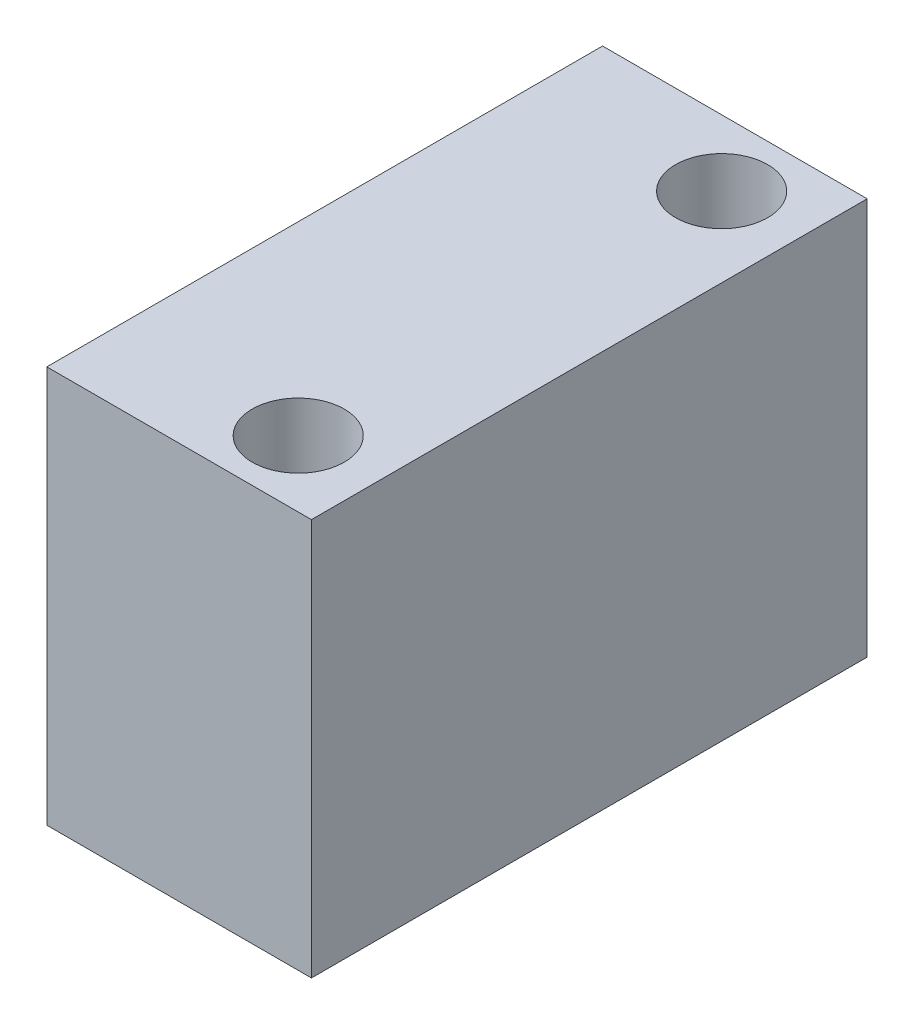
ISO-10303-21;
HEADER;
FILE_DESCRIPTION(('STEP AP214'),'2;1');
FILE_NAME('part.step','',(''),(''),'','','');
FILE_SCHEMA(('AUTOMOTIVE_DESIGN { 1 0 10303 214 1 1 1 1 }'));
ENDSEC;
DATA;
#1=APPLICATION_CONTEXT('core data for automotive mechanical design processes');
#2=APPLICATION_PROTOCOL_DEFINITION('international standard','automotive_design',2000,#1);
#3=PRODUCT_CONTEXT('',#1,'mechanical');
#4=PRODUCT('Part','Part','',(#3));
#5=PRODUCT_RELATED_PRODUCT_CATEGORY('part','',(#4));
#6=PRODUCT_DEFINITION_FORMATION('','',#4);
#7=PRODUCT_DEFINITION_CONTEXT('part definition',#1,'design');
#8=PRODUCT_DEFINITION('design','',#6,#7);
#9=PRODUCT_DEFINITION_SHAPE('','',#8);
#10=(LENGTH_UNIT() NAMED_UNIT(*) SI_UNIT(.MILLI.,.METRE.));
#11=(NAMED_UNIT(*) PLANE_ANGLE_UNIT() SI_UNIT($,.RADIAN.));
#12=(NAMED_UNIT(*) SI_UNIT($,.STERADIAN.) SOLID_ANGLE_UNIT());
#13=UNCERTAINTY_MEASURE_WITH_UNIT(LENGTH_MEASURE(1.E-05),#10,'distance_accuracy_value','');
#14=(GEOMETRIC_REPRESENTATION_CONTEXT(3) GLOBAL_UNCERTAINTY_ASSIGNED_CONTEXT((#13)) GLOBAL_UNIT_ASSIGNED_CONTEXT((#10,
#11,#12)) REPRESENTATION_CONTEXT('',''));
#15=CARTESIAN_POINT('',(0.,0.,0.));
#16=DIRECTION('',(0.,0.,1.));
#17=DIRECTION('',(1.,0.,0.));
#18=AXIS2_PLACEMENT_3D('',#15,#16,#17);
#19=CARTESIAN_POINT('',(1.905,9.525,0.));
#20=DIRECTION('',(1.,0.,0.));
#21=DIRECTION('',(0.,0.,-1.));
#22=AXIS2_PLACEMENT_3D('',#19,#20,#21);
#23=PLANE('',#22);
#24=DIRECTION('',(0.,0.,1.));
#25=VECTOR('',#24,1.);
#26=CARTESIAN_POINT('',(1.905,0.,0.));
#27=LINE('',#26,#25);
#28=CARTESIAN_POINT('',(1.905,0.,-6.6675));
#29=VERTEX_POINT('',#28);
#30=CARTESIAN_POINT('',(1.905,0.,6.6675));
#31=VERTEX_POINT('',#30);
#32=EDGE_CURVE('E114',#29,#31,#27,.T.);
#33=ORIENTED_EDGE('',*,*,#32,.F.);
#34=DIRECTION('',(0.,-1.,0.));
#35=VECTOR('',#34,1.);
#36=CARTESIAN_POINT('',(1.905,9.525,-6.6675));
#37=LINE('',#36,#35);
#38=CARTESIAN_POINT('',(1.905,9.525,-6.6675));
#39=VERTEX_POINT('',#38);
#40=EDGE_CURVE('E11',#39,#29,#37,.T.);
#41=ORIENTED_EDGE('',*,*,#40,.F.);
#42=DIRECTION('',(0.,0.,1.));
#43=VECTOR('',#42,1.);
#44=CARTESIAN_POINT('',(1.905,9.525,0.));
#45=LINE('',#44,#43);
#46=CARTESIAN_POINT('',(1.905,9.525,6.6675));
#47=VERTEX_POINT('',#46);
#48=EDGE_CURVE('E106',#39,#47,#45,.T.);
#49=ORIENTED_EDGE('',*,*,#48,.T.);
#50=DIRECTION('',(0.,-1.,0.));
#51=VECTOR('',#50,1.);
#52=CARTESIAN_POINT('',(1.905,9.525,6.6675));
#53=LINE('',#52,#51);
#54=EDGE_CURVE('E44',#47,#31,#53,.T.);
#55=ORIENTED_EDGE('',*,*,#54,.T.);
#56=EDGE_LOOP('',(#33,#41,#49,#55));
#57=FACE_BOUND('',#56,.T.);
#58=ADVANCED_FACE('F35',(#57),#23,.T.);
#59=CARTESIAN_POINT('',(0.,9.525,-6.6675));
#60=DIRECTION('',(0.,0.,-1.));
#61=DIRECTION('',(-1.,0.,0.));
#62=AXIS2_PLACEMENT_3D('',#59,#60,#61);
#63=PLANE('',#62);
#64=DIRECTION('',(1.,0.,0.));
#65=VECTOR('',#64,1.);
#66=CARTESIAN_POINT('',(0.,0.,-6.6675));
#67=LINE('',#66,#65);
#68=CARTESIAN_POINT('',(-4.445,0.,-6.6675));
#69=VERTEX_POINT('',#68);
#70=EDGE_CURVE('E116',#69,#29,#67,.T.);
#71=ORIENTED_EDGE('',*,*,#70,.F.);
#72=DIRECTION('',(0.,1.,0.));
#73=VECTOR('',#72,1.);
#74=CARTESIAN_POINT('',(-4.445,0.,-6.6675));
#75=LINE('',#74,#73);
#76=CARTESIAN_POINT('',(-4.445,9.525,-6.6675));
#77=VERTEX_POINT('',#76);
#78=EDGE_CURVE('E94',#69,#77,#75,.T.);
#79=ORIENTED_EDGE('',*,*,#78,.T.);
#80=DIRECTION('',(1.,0.,0.));
#81=VECTOR('',#80,1.);
#82=CARTESIAN_POINT('',(0.,9.525,-6.6675));
#83=LINE('',#82,#81);
#84=EDGE_CURVE('E85',#77,#39,#83,.T.);
#85=ORIENTED_EDGE('',*,*,#84,.T.);
#86=ORIENTED_EDGE('',*,*,#40,.T.);
#87=EDGE_LOOP('',(#71,#79,#85,#86));
#88=FACE_BOUND('',#87,.T.);
#89=ADVANCED_FACE('F124',(#88),#63,.T.);
#90=CARTESIAN_POINT('',(0.,9.525,6.6675));
#91=DIRECTION('',(0.,0.,-1.));
#92=DIRECTION('',(-1.,0.,0.));
#93=AXIS2_PLACEMENT_3D('',#90,#91,#92);
#94=PLANE('',#93);
#95=DIRECTION('',(1.,0.,0.));
#96=VECTOR('',#95,1.);
#97=CARTESIAN_POINT('',(0.,0.,6.6675));
#98=LINE('',#97,#96);
#99=CARTESIAN_POINT('',(-4.445,0.,6.6675));
#100=VERTEX_POINT('',#99);
#101=EDGE_CURVE('E71',#100,#31,#98,.T.);
#102=ORIENTED_EDGE('',*,*,#101,.T.);
#103=ORIENTED_EDGE('',*,*,#54,.F.);
#104=DIRECTION('',(1.,0.,0.));
#105=VECTOR('',#104,1.);
#106=CARTESIAN_POINT('',(0.,9.525,6.6675));
#107=LINE('',#106,#105);
#108=CARTESIAN_POINT('',(-4.445,9.525,6.6675));
#109=VERTEX_POINT('',#108);
#110=EDGE_CURVE('E52',#109,#47,#107,.T.);
#111=ORIENTED_EDGE('',*,*,#110,.F.);
#112=DIRECTION('',(0.,1.,0.));
#113=VECTOR('',#112,1.);
#114=CARTESIAN_POINT('',(-4.445,0.,6.6675));
#115=LINE('',#114,#113);
#116=EDGE_CURVE('E81',#100,#109,#115,.T.);
#117=ORIENTED_EDGE('',*,*,#116,.F.);
#118=EDGE_LOOP('',(#102,#103,#111,#117));
#119=FACE_BOUND('',#118,.T.);
#120=ADVANCED_FACE('F80',(#119),#94,.F.);
#121=CARTESIAN_POINT('',(0.,9.525,-5.08));
#122=DIRECTION('',(0.,-1.,0.));
#123=DIRECTION('',(0.,0.,-1.));
#124=AXIS2_PLACEMENT_3D('',#121,#122,#123);
#125=CYLINDRICAL_SURFACE('',#124,1.1049);
#126=CARTESIAN_POINT('',(0.,9.525,-5.08));
#127=DIRECTION('',(0.,1.,0.));
#128=DIRECTION('',(0.,0.,1.));
#129=AXIS2_PLACEMENT_3D('',#126,#127,#128);
#130=CIRCLE('',#129,1.1049);
#131=CARTESIAN_POINT('',(0.,9.525,-6.1849));
#132=VERTEX_POINT('',#131);
#133=EDGE_CURVE('E103',#132,#132,#130,.T.);
#134=CARTESIAN_POINT('',(0.,0.,-5.08));
#135=DIRECTION('',(0.,1.,0.));
#136=DIRECTION('',(0.,0.,1.));
#137=AXIS2_PLACEMENT_3D('',#134,#135,#136);
#138=CIRCLE('',#137,1.1049);
#139=CARTESIAN_POINT('',(0.,0.,-6.1849));
#140=VERTEX_POINT('',#139);
#141=EDGE_CURVE('E93',#140,#140,#138,.T.);
#142=CARTESIAN_POINT('',(0.,9.525,-6.1849));
#143=CARTESIAN_POINT('',(0.,9.42578125,-6.1849));
#144=CARTESIAN_POINT('',(0.,9.3265625,-6.1849));
#145=CARTESIAN_POINT('',(0.,9.128125,-6.1849));
#146=CARTESIAN_POINT('',(0.,9.02890625,-6.1849));
#147=CARTESIAN_POINT('',(0.,8.83046875,-6.1849));
#148=CARTESIAN_POINT('',(0.,8.73125,-6.1849));
#149=CARTESIAN_POINT('',(0.,8.5328125,-6.1849));
#150=CARTESIAN_POINT('',(0.,8.43359375,-6.1849));
#151=CARTESIAN_POINT('',(0.,8.23515625,-6.1849));
#152=CARTESIAN_POINT('',(0.,8.1359375,-6.1849));
#153=CARTESIAN_POINT('',(0.,7.9375,-6.1849));
#154=CARTESIAN_POINT('',(0.,7.83828125,-6.1849));
#155=CARTESIAN_POINT('',(0.,7.63984375,-6.1849));
#156=CARTESIAN_POINT('',(0.,7.540625,-6.1849));
#157=CARTESIAN_POINT('',(0.,7.3421875,-6.1849));
#158=CARTESIAN_POINT('',(0.,7.24296875,-6.1849));
#159=CARTESIAN_POINT('',(0.,7.04453125,-6.1849));
#160=CARTESIAN_POINT('',(0.,6.9453125,-6.1849));
#161=CARTESIAN_POINT('',(0.,6.746875,-6.1849));
#162=CARTESIAN_POINT('',(0.,6.64765625,-6.1849));
#163=CARTESIAN_POINT('',(0.,6.44921875,-6.1849));
#164=CARTESIAN_POINT('',(0.,6.35,-6.1849));
#165=CARTESIAN_POINT('',(0.,6.1515625,-6.1849));
#166=CARTESIAN_POINT('',(0.,6.05234375,-6.1849));
#167=CARTESIAN_POINT('',(0.,5.85390625,-6.1849));
#168=CARTESIAN_POINT('',(0.,5.7546875,-6.1849));
#169=CARTESIAN_POINT('',(0.,5.55625,-6.1849));
#170=CARTESIAN_POINT('',(0.,5.45703125,-6.1849));
#171=CARTESIAN_POINT('',(0.,5.25859375,-6.1849));
#172=CARTESIAN_POINT('',(0.,5.159375,-6.1849));
#173=CARTESIAN_POINT('',(0.,4.9609375,-6.1849));
#174=CARTESIAN_POINT('',(0.,4.86171875,-6.1849));
#175=CARTESIAN_POINT('',(0.,4.66328125,-6.1849));
#176=CARTESIAN_POINT('',(0.,4.5640625,-6.1849));
#177=CARTESIAN_POINT('',(0.,4.365625,-6.1849));
#178=CARTESIAN_POINT('',(0.,4.26640625,-6.1849));
#179=CARTESIAN_POINT('',(0.,4.06796875,-6.1849));
#180=CARTESIAN_POINT('',(0.,3.96875,-6.1849));
#181=CARTESIAN_POINT('',(0.,3.7703125,-6.1849));
#182=CARTESIAN_POINT('',(0.,3.67109375,-6.1849));
#183=CARTESIAN_POINT('',(0.,3.47265625,-6.1849));
#184=CARTESIAN_POINT('',(0.,3.3734375,-6.1849));
#185=CARTESIAN_POINT('',(0.,3.175,-6.1849));
#186=CARTESIAN_POINT('',(0.,3.07578125,-6.1849));
#187=CARTESIAN_POINT('',(0.,2.87734375,-6.1849));
#188=CARTESIAN_POINT('',(0.,2.778125,-6.1849));
#189=CARTESIAN_POINT('',(0.,2.5796875,-6.1849));
#190=CARTESIAN_POINT('',(0.,2.48046875,-6.1849));
#191=CARTESIAN_POINT('',(0.,2.28203125,-6.1849));
#192=CARTESIAN_POINT('',(0.,2.1828125,-6.1849));
#193=CARTESIAN_POINT('',(0.,1.984375,-6.1849));
#194=CARTESIAN_POINT('',(0.,1.88515625,-6.1849));
#195=CARTESIAN_POINT('',(0.,1.68671875,-6.1849));
#196=CARTESIAN_POINT('',(0.,1.5875,-6.1849));
#197=CARTESIAN_POINT('',(0.,1.3890625,-6.1849));
#198=CARTESIAN_POINT('',(0.,1.28984375,-6.1849));
#199=CARTESIAN_POINT('',(0.,1.09140625,-6.1849));
#200=CARTESIAN_POINT('',(0.,0.992187500000001,-6.1849));
#201=CARTESIAN_POINT('',(0.,0.793750000000001,-6.1849));
#202=CARTESIAN_POINT('',(0.,0.69453125,-6.1849));
#203=CARTESIAN_POINT('',(0.,0.49609375,-6.1849));
#204=CARTESIAN_POINT('',(0.,0.396875,-6.1849));
#205=CARTESIAN_POINT('',(0.,0.1984375,-6.1849));
#206=CARTESIAN_POINT('',(0.,0.0992187500000001,-6.1849));
#207=CARTESIAN_POINT('',(0.,0.,-6.1849));
#208=B_SPLINE_CURVE_WITH_KNOTS('',3,(#142,#143,#144,#145,#146,#147,#148,#149,#150,#151,#152,
#153,#154,#155,#156,#157,#158,#159,#160,#161,#162,#163,#164,#165,#166,#167,#168,#169,#170,#171,
#172,#173,#174,#175,#176,#177,#178,#179,#180,#181,#182,#183,#184,#185,#186,#187,#188,#189,#190,
#191,#192,#193,#194,#195,#196,#197,#198,#199,#200,#201,#202,#203,#204,#205,#206,#207),
.UNSPECIFIED.,.F.,.F.,(4,2,2,2,2,2,2,2,2,2,2,2,2,2,2,2,2,2,2,2,2,2,2,2,2,2,2,2,2,2,2,2,4),(0.,
0.297656249999998,0.595312499999999,0.892968749999999,1.190625,1.48828125,1.7859375,2.08359375,
2.38125,2.67890625,2.9765625,3.27421875,3.571875,3.86953125,4.1671875,4.46484375,4.7625,
5.06015625,5.3578125,5.65546875,5.953125,6.25078125,6.5484375,6.84609375,7.14375,7.44140625,
7.7390625,8.03671875,8.334375,8.63203125,8.9296875,9.22734375,9.525),.UNSPECIFIED.);
#209=EDGE_CURVE('BSEAM37',#132,#140,#208,.T.);
#210=ORIENTED_EDGE('',*,*,#133,.T.);
#211=ORIENTED_EDGE('',*,*,#141,.F.);
#212=ORIENTED_EDGE('',*,*,#209,.T.);
#213=ORIENTED_EDGE('',*,*,#209,.F.);
#214=EDGE_LOOP('',(#210,#212,#211,#213));
#215=FACE_BOUND('',#214,.T.);
#216=ADVANCED_FACE('F37',(#215),#125,.F.);
#217=CARTESIAN_POINT('',(0.,9.525,5.08));
#218=DIRECTION('',(0.,-1.,0.));
#219=DIRECTION('',(0.,0.,-1.));
#220=AXIS2_PLACEMENT_3D('',#217,#218,#219);
#221=CYLINDRICAL_SURFACE('',#220,1.1049);
#222=CARTESIAN_POINT('',(0.,9.525,5.08));
#223=DIRECTION('',(0.,1.,0.));
#224=DIRECTION('',(0.,0.,1.));
#225=AXIS2_PLACEMENT_3D('',#222,#223,#224);
#226=CIRCLE('',#225,1.1049);
#227=CARTESIAN_POINT('',(0.,9.525,3.9751));
#228=VERTEX_POINT('',#227);
#229=EDGE_CURVE('E84',#228,#228,#226,.F.);
#230=CARTESIAN_POINT('',(0.,0.,5.08));
#231=DIRECTION('',(0.,1.,0.));
#232=DIRECTION('',(0.,0.,1.));
#233=AXIS2_PLACEMENT_3D('',#230,#231,#232);
#234=CIRCLE('',#233,1.1049);
#235=CARTESIAN_POINT('',(0.,0.,3.9751));
#236=VERTEX_POINT('',#235);
#237=EDGE_CURVE('E107',#236,#236,#234,.F.);
#238=CARTESIAN_POINT('',(0.,9.525,3.9751));
#239=CARTESIAN_POINT('',(0.,9.42578125,3.9751));
#240=CARTESIAN_POINT('',(0.,9.3265625,3.9751));
#241=CARTESIAN_POINT('',(0.,9.128125,3.9751));
#242=CARTESIAN_POINT('',(0.,9.02890625,3.9751));
#243=CARTESIAN_POINT('',(0.,8.83046875,3.9751));
#244=CARTESIAN_POINT('',(0.,8.73125,3.9751));
#245=CARTESIAN_POINT('',(0.,8.5328125,3.9751));
#246=CARTESIAN_POINT('',(0.,8.43359375,3.9751));
#247=CARTESIAN_POINT('',(0.,8.23515625,3.9751));
#248=CARTESIAN_POINT('',(0.,8.1359375,3.9751));
#249=CARTESIAN_POINT('',(0.,7.9375,3.9751));
#250=CARTESIAN_POINT('',(0.,7.83828125,3.9751));
#251=CARTESIAN_POINT('',(0.,7.63984375,3.9751));
#252=CARTESIAN_POINT('',(0.,7.540625,3.9751));
#253=CARTESIAN_POINT('',(0.,7.3421875,3.9751));
#254=CARTESIAN_POINT('',(0.,7.24296875,3.9751));
#255=CARTESIAN_POINT('',(0.,7.04453125,3.9751));
#256=CARTESIAN_POINT('',(0.,6.9453125,3.9751));
#257=CARTESIAN_POINT('',(0.,6.746875,3.9751));
#258=CARTESIAN_POINT('',(0.,6.64765625,3.9751));
#259=CARTESIAN_POINT('',(0.,6.44921875,3.9751));
#260=CARTESIAN_POINT('',(0.,6.35,3.9751));
#261=CARTESIAN_POINT('',(0.,6.1515625,3.9751));
#262=CARTESIAN_POINT('',(0.,6.05234375,3.9751));
#263=CARTESIAN_POINT('',(0.,5.85390625,3.9751));
#264=CARTESIAN_POINT('',(0.,5.7546875,3.9751));
#265=CARTESIAN_POINT('',(0.,5.55625,3.9751));
#266=CARTESIAN_POINT('',(0.,5.45703125,3.9751));
#267=CARTESIAN_POINT('',(0.,5.25859375,3.9751));
#268=CARTESIAN_POINT('',(0.,5.159375,3.9751));
#269=CARTESIAN_POINT('',(0.,4.9609375,3.9751));
#270=CARTESIAN_POINT('',(0.,4.86171875,3.9751));
#271=CARTESIAN_POINT('',(0.,4.66328125,3.9751));
#272=CARTESIAN_POINT('',(0.,4.5640625,3.9751));
#273=CARTESIAN_POINT('',(0.,4.365625,3.9751));
#274=CARTESIAN_POINT('',(0.,4.26640625,3.9751));
#275=CARTESIAN_POINT('',(0.,4.06796875,3.9751));
#276=CARTESIAN_POINT('',(0.,3.96875,3.9751));
#277=CARTESIAN_POINT('',(0.,3.7703125,3.9751));
#278=CARTESIAN_POINT('',(0.,3.67109375,3.9751));
#279=CARTESIAN_POINT('',(0.,3.47265625,3.9751));
#280=CARTESIAN_POINT('',(0.,3.3734375,3.9751));
#281=CARTESIAN_POINT('',(0.,3.175,3.9751));
#282=CARTESIAN_POINT('',(0.,3.07578125,3.9751));
#283=CARTESIAN_POINT('',(0.,2.87734375,3.9751));
#284=CARTESIAN_POINT('',(0.,2.778125,3.9751));
#285=CARTESIAN_POINT('',(0.,2.5796875,3.9751));
#286=CARTESIAN_POINT('',(0.,2.48046875,3.9751));
#287=CARTESIAN_POINT('',(0.,2.28203125,3.9751));
#288=CARTESIAN_POINT('',(0.,2.1828125,3.9751));
#289=CARTESIAN_POINT('',(0.,1.984375,3.9751));
#290=CARTESIAN_POINT('',(0.,1.88515625,3.9751));
#291=CARTESIAN_POINT('',(0.,1.68671875,3.9751));
#292=CARTESIAN_POINT('',(0.,1.5875,3.9751));
#293=CARTESIAN_POINT('',(0.,1.3890625,3.9751));
#294=CARTESIAN_POINT('',(0.,1.28984375,3.9751));
#295=CARTESIAN_POINT('',(0.,1.09140625,3.9751));
#296=CARTESIAN_POINT('',(0.,0.992187500000001,3.9751));
#297=CARTESIAN_POINT('',(0.,0.793750000000001,3.9751));
#298=CARTESIAN_POINT('',(0.,0.69453125,3.9751));
#299=CARTESIAN_POINT('',(0.,0.49609375,3.9751));
#300=CARTESIAN_POINT('',(0.,0.396875,3.9751));
#301=CARTESIAN_POINT('',(0.,0.1984375,3.9751));
#302=CARTESIAN_POINT('',(0.,0.0992187500000001,3.9751));
#303=CARTESIAN_POINT('',(0.,0.,3.9751));
#304=B_SPLINE_CURVE_WITH_KNOTS('',3,(#238,#239,#240,#241,#242,#243,#244,#245,#246,#247,#248,
#249,#250,#251,#252,#253,#254,#255,#256,#257,#258,#259,#260,#261,#262,#263,#264,#265,#266,#267,
#268,#269,#270,#271,#272,#273,#274,#275,#276,#277,#278,#279,#280,#281,#282,#283,#284,#285,#286,
#287,#288,#289,#290,#291,#292,#293,#294,#295,#296,#297,#298,#299,#300,#301,#302,#303),
.UNSPECIFIED.,.F.,.F.,(4,2,2,2,2,2,2,2,2,2,2,2,2,2,2,2,2,2,2,2,2,2,2,2,2,2,2,2,2,2,2,2,4),(0.,
0.297656249999998,0.595312499999999,0.892968749999999,1.190625,1.48828125,1.7859375,2.08359375,
2.38125,2.67890625,2.9765625,3.27421875,3.571875,3.86953125,4.1671875,4.46484375,4.7625,
5.06015625,5.3578125,5.65546875,5.953125,6.25078125,6.5484375,6.84609375,7.14375,7.44140625,
7.7390625,8.03671875,8.334375,8.63203125,8.9296875,9.22734375,9.525),.UNSPECIFIED.);
#305=EDGE_CURVE('BSEAM133',#228,#236,#304,.T.);
#306=ORIENTED_EDGE('',*,*,#229,.F.);
#307=ORIENTED_EDGE('',*,*,#237,.T.);
#308=ORIENTED_EDGE('',*,*,#305,.T.);
#309=ORIENTED_EDGE('',*,*,#305,.F.);
#310=EDGE_LOOP('',(#306,#308,#307,#309));
#311=FACE_BOUND('',#310,.T.);
#312=ADVANCED_FACE('F133',(#311),#221,.F.);
#313=CARTESIAN_POINT('',(0.,9.525,0.));
#314=DIRECTION('',(0.,1.,0.));
#315=DIRECTION('',(0.,0.,1.));
#316=AXIS2_PLACEMENT_3D('',#313,#314,#315);
#317=PLANE('',#316);
#318=ORIENTED_EDGE('',*,*,#133,.F.);
#319=EDGE_LOOP('',(#318));
#320=FACE_BOUND('',#319,.T.);
#321=ORIENTED_EDGE('',*,*,#48,.F.);
#322=ORIENTED_EDGE('',*,*,#84,.F.);
#323=DIRECTION('',(0.,0.,1.));
#324=VECTOR('',#323,1.);
#325=CARTESIAN_POINT('',(-4.445,9.525,-6.6675));
#326=LINE('',#325,#324);
#327=EDGE_CURVE('E91',#77,#109,#326,.T.);
#328=ORIENTED_EDGE('',*,*,#327,.T.);
#329=ORIENTED_EDGE('',*,*,#110,.T.);
#330=EDGE_LOOP('',(#321,#322,#328,#329));
#331=FACE_BOUND('',#330,.T.);
#332=ORIENTED_EDGE('',*,*,#229,.T.);
#333=EDGE_LOOP('',(#332));
#334=FACE_BOUND('',#333,.T.);
#335=ADVANCED_FACE('F96',(#320,#331,#334),#317,.T.);
#336=CARTESIAN_POINT('',(0.,0.,0.));
#337=DIRECTION('',(0.,1.,0.));
#338=DIRECTION('',(0.,0.,1.));
#339=AXIS2_PLACEMENT_3D('',#336,#337,#338);
#340=PLANE('',#339);
#341=ORIENTED_EDGE('',*,*,#141,.T.);
#342=EDGE_LOOP('',(#341));
#343=FACE_BOUND('',#342,.T.);
#344=ORIENTED_EDGE('',*,*,#32,.T.);
#345=ORIENTED_EDGE('',*,*,#101,.F.);
#346=DIRECTION('',(0.,0.,1.));
#347=VECTOR('',#346,1.);
#348=CARTESIAN_POINT('',(-4.445,0.,-6.6675));
#349=LINE('',#348,#347);
#350=EDGE_CURVE('E92',#69,#100,#349,.T.);
#351=ORIENTED_EDGE('',*,*,#350,.F.);
#352=ORIENTED_EDGE('',*,*,#70,.T.);
#353=EDGE_LOOP('',(#344,#345,#351,#352));
#354=FACE_BOUND('',#353,.T.);
#355=ORIENTED_EDGE('',*,*,#237,.F.);
#356=EDGE_LOOP('',(#355));
#357=FACE_BOUND('',#356,.T.);
#358=ADVANCED_FACE('F122',(#343,#354,#357),#340,.F.);
#359=CARTESIAN_POINT('',(-4.445,0.,-6.6675));
#360=DIRECTION('',(-1.,0.,0.));
#361=DIRECTION('',(0.,0.,1.));
#362=AXIS2_PLACEMENT_3D('',#359,#360,#361);
#363=PLANE('',#362);
#364=ORIENTED_EDGE('',*,*,#327,.F.);
#365=ORIENTED_EDGE('',*,*,#78,.F.);
#366=ORIENTED_EDGE('',*,*,#350,.T.);
#367=ORIENTED_EDGE('',*,*,#116,.T.);
#368=EDGE_LOOP('',(#364,#365,#366,#367));
#369=FACE_BOUND('',#368,.T.);
#370=ADVANCED_FACE('F89',(#369),#363,.T.);
#371=CLOSED_SHELL('',(#58,#89,#120,#216,#312,#335,#358,#370));
#372=MANIFOLD_SOLID_BREP('B2',#371);
#373=ADVANCED_BREP_SHAPE_REPRESENTATION('',(#18,#372),#14);
#374=SHAPE_DEFINITION_REPRESENTATION(#9,#373);
ENDSEC;
END-ISO-10303-21;
